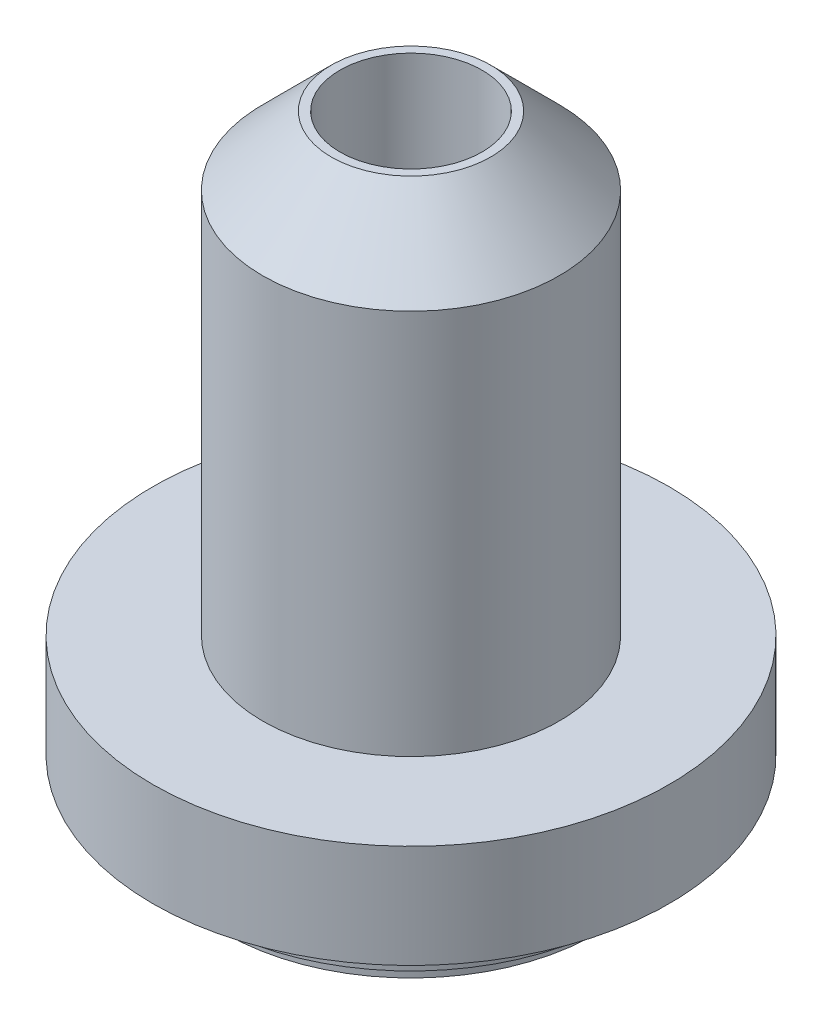
ISO-10303-21;
HEADER;
FILE_DESCRIPTION(('STEP AP214'),'2;1');
FILE_NAME('part.step','',(''),(''),'','','');
FILE_SCHEMA(('AUTOMOTIVE_DESIGN { 1 0 10303 214 1 1 1 1 }'));
ENDSEC;
DATA;
#1=APPLICATION_CONTEXT('core data for automotive mechanical design processes');
#2=APPLICATION_PROTOCOL_DEFINITION('international standard','automotive_design',2000,#1);
#3=PRODUCT_CONTEXT('',#1,'mechanical');
#4=PRODUCT('Part','Part','',(#3));
#5=PRODUCT_RELATED_PRODUCT_CATEGORY('part','',(#4));
#6=PRODUCT_DEFINITION_FORMATION('','',#4);
#7=PRODUCT_DEFINITION_CONTEXT('part definition',#1,'design');
#8=PRODUCT_DEFINITION('design','',#6,#7);
#9=PRODUCT_DEFINITION_SHAPE('','',#8);
#10=(LENGTH_UNIT() NAMED_UNIT(*) SI_UNIT(.MILLI.,.METRE.));
#11=(NAMED_UNIT(*) PLANE_ANGLE_UNIT() SI_UNIT($,.RADIAN.));
#12=(NAMED_UNIT(*) SI_UNIT($,.STERADIAN.) SOLID_ANGLE_UNIT());
#13=UNCERTAINTY_MEASURE_WITH_UNIT(LENGTH_MEASURE(1.E-05),#10,'distance_accuracy_value','');
#14=(GEOMETRIC_REPRESENTATION_CONTEXT(3) GLOBAL_UNCERTAINTY_ASSIGNED_CONTEXT((#13)) GLOBAL_UNIT_ASSIGNED_CONTEXT((#10,
#11,#12)) REPRESENTATION_CONTEXT('',''));
#15=CARTESIAN_POINT('',(0.,0.,0.));
#16=DIRECTION('',(0.,0.,1.));
#17=DIRECTION('',(1.,0.,0.));
#18=AXIS2_PLACEMENT_3D('',#15,#16,#17);
#19=CARTESIAN_POINT('',(0.,17.145,0.));
#20=DIRECTION('',(0.,-1.,0.));
#21=DIRECTION('',(0.,0.,-1.));
#22=AXIS2_PLACEMENT_3D('',#19,#20,#21);
#23=CYLINDRICAL_SURFACE('',#22,4.5593);
#24=CARTESIAN_POINT('',(0.,3.175,0.));
#25=DIRECTION('',(0.,1.,0.));
#26=DIRECTION('',(0.,0.,1.));
#27=AXIS2_PLACEMENT_3D('',#24,#25,#26);
#28=CIRCLE('',#27,4.5593);
#29=CARTESIAN_POINT('',(0.,3.175,4.5593));
#30=VERTEX_POINT('',#29);
#31=EDGE_CURVE('E10',#30,#30,#28,.T.);
#32=ORIENTED_EDGE('',*,*,#31,.T.);
#33=EDGE_LOOP('',(#32));
#34=FACE_BOUND('',#33,.T.);
#35=CARTESIAN_POINT('',(0.,15.0368,0.));
#36=DIRECTION('',(0.,-1.,0.));
#37=DIRECTION('',(0.,0.,-1.));
#38=AXIS2_PLACEMENT_3D('',#35,#36,#37);
#39=CIRCLE('',#38,4.5593);
#40=CARTESIAN_POINT('',(0.,15.0368,-4.5593));
#41=VERTEX_POINT('',#40);
#42=EDGE_CURVE('E56',#41,#41,#39,.F.);
#43=ORIENTED_EDGE('',*,*,#42,.F.);
#44=EDGE_LOOP('',(#43));
#45=FACE_BOUND('',#44,.T.);
#46=ADVANCED_FACE('F37',(#34,#45),#23,.T.);
#47=CARTESIAN_POINT('',(0.,3.175,0.));
#48=DIRECTION('',(0.,-1.,0.));
#49=DIRECTION('',(0.,0.,-1.));
#50=AXIS2_PLACEMENT_3D('',#47,#48,#49);
#51=CYLINDRICAL_SURFACE('',#50,7.9375);
#52=CARTESIAN_POINT('',(0.,3.175,0.));
#53=DIRECTION('',(0.,1.,0.));
#54=DIRECTION('',(0.,0.,1.));
#55=AXIS2_PLACEMENT_3D('',#52,#53,#54);
#56=CIRCLE('',#55,7.9375);
#57=CARTESIAN_POINT('',(0.,3.175,7.9375));
#58=VERTEX_POINT('',#57);
#59=EDGE_CURVE('E68',#58,#58,#56,.T.);
#60=ORIENTED_EDGE('',*,*,#59,.F.);
#61=EDGE_LOOP('',(#60));
#62=FACE_BOUND('',#61,.T.);
#63=CARTESIAN_POINT('',(0.,0.,0.));
#64=DIRECTION('',(0.,1.,0.));
#65=DIRECTION('',(0.,0.,1.));
#66=AXIS2_PLACEMENT_3D('',#63,#64,#65);
#67=CIRCLE('',#66,7.9375);
#68=CARTESIAN_POINT('',(0.,0.,7.9375));
#69=VERTEX_POINT('',#68);
#70=EDGE_CURVE('E41',#69,#69,#67,.T.);
#71=ORIENTED_EDGE('',*,*,#70,.T.);
#72=EDGE_LOOP('',(#71));
#73=FACE_BOUND('',#72,.T.);
#74=ADVANCED_FACE('F39',(#62,#73),#51,.T.);
#75=CARTESIAN_POINT('',(0.,3.175,0.));
#76=DIRECTION('',(0.,1.,0.));
#77=DIRECTION('',(0.,0.,1.));
#78=AXIS2_PLACEMENT_3D('',#75,#76,#77);
#79=PLANE('',#78);
#80=ORIENTED_EDGE('',*,*,#31,.F.);
#81=EDGE_LOOP('',(#80));
#82=FACE_BOUND('',#81,.T.);
#83=ORIENTED_EDGE('',*,*,#59,.T.);
#84=EDGE_LOOP('',(#83));
#85=FACE_BOUND('',#84,.T.);
#86=ADVANCED_FACE('F81',(#82,#85),#79,.T.);
#87=CARTESIAN_POINT('',(0.,0.,0.));
#88=DIRECTION('',(0.,1.,0.));
#89=DIRECTION('',(0.,0.,1.));
#90=AXIS2_PLACEMENT_3D('',#87,#88,#89);
#91=PLANE('',#90);
#92=CARTESIAN_POINT('',(0.,0.,0.));
#93=DIRECTION('',(0.,-1.,0.));
#94=DIRECTION('',(0.,0.,-1.));
#95=AXIS2_PLACEMENT_3D('',#92,#93,#94);
#96=CIRCLE('',#95,6.35);
#97=CARTESIAN_POINT('',(0.,0.,-6.35));
#98=VERTEX_POINT('',#97);
#99=EDGE_CURVE('E52',#98,#98,#96,.T.);
#100=ORIENTED_EDGE('',*,*,#99,.F.);
#101=EDGE_LOOP('',(#100));
#102=FACE_BOUND('',#101,.T.);
#103=ORIENTED_EDGE('',*,*,#70,.F.);
#104=EDGE_LOOP('',(#103));
#105=FACE_BOUND('',#104,.T.);
#106=ADVANCED_FACE('F78',(#102,#105),#91,.F.);
#107=CARTESIAN_POINT('',(0.,-1.27,0.));
#108=DIRECTION('',(0.,1.,0.));
#109=DIRECTION('',(0.,0.,1.));
#110=AXIS2_PLACEMENT_3D('',#107,#108,#109);
#111=CYLINDRICAL_SURFACE('',#110,6.35);
#112=CARTESIAN_POINT('',(0.,-1.27,0.));
#113=DIRECTION('',(0.,-1.,0.));
#114=DIRECTION('',(0.,0.,-1.));
#115=AXIS2_PLACEMENT_3D('',#112,#113,#114);
#116=CIRCLE('',#115,6.35);
#117=CARTESIAN_POINT('',(0.,-1.27,-6.35));
#118=VERTEX_POINT('',#117);
#119=EDGE_CURVE('E61',#118,#118,#116,.T.);
#120=ORIENTED_EDGE('',*,*,#119,.F.);
#121=EDGE_LOOP('',(#120));
#122=FACE_BOUND('',#121,.T.);
#123=ORIENTED_EDGE('',*,*,#99,.T.);
#124=EDGE_LOOP('',(#123));
#125=FACE_BOUND('',#124,.T.);
#126=ADVANCED_FACE('F80',(#122,#125),#111,.T.);
#127=CARTESIAN_POINT('',(0.,-1.27,0.));
#128=DIRECTION('',(0.,-1.,0.));
#129=DIRECTION('',(0.,0.,-1.));
#130=AXIS2_PLACEMENT_3D('',#127,#128,#129);
#131=PLANE('',#130);
#132=CARTESIAN_POINT('',(0.,-1.27,0.));
#133=DIRECTION('',(0.,-1.,0.));
#134=DIRECTION('',(0.,0.,-1.));
#135=AXIS2_PLACEMENT_3D('',#132,#133,#134);
#136=CIRCLE('',#135,5.715);
#137=CARTESIAN_POINT('',(0.,-1.27,-5.715));
#138=VERTEX_POINT('',#137);
#139=EDGE_CURVE('E46',#138,#138,#136,.T.);
#140=ORIENTED_EDGE('',*,*,#139,.F.);
#141=EDGE_LOOP('',(#140));
#142=FACE_BOUND('',#141,.T.);
#143=ORIENTED_EDGE('',*,*,#119,.T.);
#144=EDGE_LOOP('',(#143));
#145=FACE_BOUND('',#144,.T.);
#146=ADVANCED_FACE('F87',(#142,#145),#131,.T.);
#147=CARTESIAN_POINT('',(0.,-1.905,0.));
#148=DIRECTION('',(0.,1.,0.));
#149=DIRECTION('',(0.,0.,1.));
#150=AXIS2_PLACEMENT_3D('',#147,#148,#149);
#151=CYLINDRICAL_SURFACE('',#150,5.715);
#152=CARTESIAN_POINT('',(0.,-1.905,0.));
#153=DIRECTION('',(0.,-1.,0.));
#154=DIRECTION('',(0.,0.,-1.));
#155=AXIS2_PLACEMENT_3D('',#152,#153,#154);
#156=CIRCLE('',#155,5.715);
#157=CARTESIAN_POINT('',(0.,-1.905,-5.715));
#158=VERTEX_POINT('',#157);
#159=EDGE_CURVE('E58',#158,#158,#156,.T.);
#160=ORIENTED_EDGE('',*,*,#159,.F.);
#161=EDGE_LOOP('',(#160));
#162=FACE_BOUND('',#161,.T.);
#163=ORIENTED_EDGE('',*,*,#139,.T.);
#164=EDGE_LOOP('',(#163));
#165=FACE_BOUND('',#164,.T.);
#166=ADVANCED_FACE('F108',(#162,#165),#151,.T.);
#167=CARTESIAN_POINT('',(0.,-1.905,0.));
#168=DIRECTION('',(0.,-1.,0.));
#169=DIRECTION('',(0.,0.,-1.));
#170=AXIS2_PLACEMENT_3D('',#167,#168,#169);
#171=PLANE('',#170);
#172=CARTESIAN_POINT('',(0.,-1.905,0.));
#173=DIRECTION('',(0.,1.,0.));
#174=DIRECTION('',(0.,0.,1.));
#175=AXIS2_PLACEMENT_3D('',#172,#173,#174);
#176=CIRCLE('',#175,2.1844);
#177=CARTESIAN_POINT('',(0.,-1.905,2.1844));
#178=VERTEX_POINT('',#177);
#179=EDGE_CURVE('E193',#178,#178,#176,.T.);
#180=ORIENTED_EDGE('',*,*,#179,.T.);
#181=EDGE_LOOP('',(#180));
#182=FACE_BOUND('',#181,.T.);
#183=ORIENTED_EDGE('',*,*,#159,.T.);
#184=EDGE_LOOP('',(#183));
#185=FACE_BOUND('',#184,.T.);
#186=ADVANCED_FACE('F104',(#182,#185),#171,.T.);
#187=CARTESIAN_POINT('',(0.,17.145,0.));
#188=DIRECTION('',(0.,-1.,0.));
#189=DIRECTION('',(0.,0.,1.));
#190=AXIS2_PLACEMENT_3D('',#187,#188,#189);
#191=CONICAL_SURFACE('',#190,2.4511,0.78539816339745);
#192=CARTESIAN_POINT('',(0.,17.145,0.));
#193=DIRECTION('',(0.,1.,0.));
#194=DIRECTION('',(0.,0.,1.));
#195=AXIS2_PLACEMENT_3D('',#192,#193,#194);
#196=CIRCLE('',#195,2.4511);
#197=CARTESIAN_POINT('',(0.,17.145,2.4511));
#198=VERTEX_POINT('',#197);
#199=EDGE_CURVE('E200',#198,#198,#196,.T.);
#200=ORIENTED_EDGE('',*,*,#199,.F.);
#201=EDGE_LOOP('',(#200));
#202=FACE_BOUND('',#201,.T.);
#203=ORIENTED_EDGE('',*,*,#42,.T.);
#204=EDGE_LOOP('',(#203));
#205=FACE_BOUND('',#204,.T.);
#206=ADVANCED_FACE('F107',(#202,#205),#191,.T.);
#207=CARTESIAN_POINT('',(0.,17.145,0.));
#208=DIRECTION('',(0.,1.,0.));
#209=DIRECTION('',(0.,0.,1.));
#210=AXIS2_PLACEMENT_3D('',#207,#208,#209);
#211=PLANE('',#210);
#212=CARTESIAN_POINT('',(0.,17.145,0.));
#213=DIRECTION('',(0.,1.,0.));
#214=DIRECTION('',(0.,0.,1.));
#215=AXIS2_PLACEMENT_3D('',#212,#213,#214);
#216=CIRCLE('',#215,2.1844);
#217=CARTESIAN_POINT('',(0.,17.145,2.1844));
#218=VERTEX_POINT('',#217);
#219=EDGE_CURVE('E196',#218,#218,#216,.T.);
#220=ORIENTED_EDGE('',*,*,#219,.F.);
#221=EDGE_LOOP('',(#220));
#222=FACE_BOUND('',#221,.T.);
#223=ORIENTED_EDGE('',*,*,#199,.T.);
#224=EDGE_LOOP('',(#223));
#225=FACE_BOUND('',#224,.T.);
#226=ADVANCED_FACE('F102',(#222,#225),#211,.T.);
#227=CARTESIAN_POINT('',(0.,-1.905,0.));
#228=DIRECTION('',(0.,1.,0.));
#229=DIRECTION('',(0.,0.,1.));
#230=AXIS2_PLACEMENT_3D('',#227,#228,#229);
#231=CYLINDRICAL_SURFACE('',#230,2.1844);
#232=CARTESIAN_POINT('',(0.,-1.905,2.1844));
#233=CARTESIAN_POINT('',(0.,-1.7065625,2.1844));
#234=CARTESIAN_POINT('',(0.,-1.508125,2.1844));
#235=CARTESIAN_POINT('',(0.,-1.11125,2.1844));
#236=CARTESIAN_POINT('',(0.,-0.9128125,2.1844));
#237=CARTESIAN_POINT('',(0.,-0.5159375,2.1844));
#238=CARTESIAN_POINT('',(0.,-0.3175,2.1844));
#239=CARTESIAN_POINT('',(0.,0.0793749999999997,2.1844));
#240=CARTESIAN_POINT('',(0.,0.2778125,2.1844));
#241=CARTESIAN_POINT('',(0.,0.6746875,2.1844));
#242=CARTESIAN_POINT('',(0.,0.873125,2.1844));
#243=CARTESIAN_POINT('',(0.,1.27,2.1844));
#244=CARTESIAN_POINT('',(0.,1.4684375,2.1844));
#245=CARTESIAN_POINT('',(0.,1.8653125,2.1844));
#246=CARTESIAN_POINT('',(0.,2.06375,2.1844));
#247=CARTESIAN_POINT('',(0.,2.460625,2.1844));
#248=CARTESIAN_POINT('',(0.,2.6590625,2.1844));
#249=CARTESIAN_POINT('',(0.,3.0559375,2.1844));
#250=CARTESIAN_POINT('',(0.,3.254375,2.1844));
#251=CARTESIAN_POINT('',(0.,3.65125,2.1844));
#252=CARTESIAN_POINT('',(0.,3.8496875,2.1844));
#253=CARTESIAN_POINT('',(0.,4.2465625,2.1844));
#254=CARTESIAN_POINT('',(0.,4.445,2.1844));
#255=CARTESIAN_POINT('',(0.,4.841875,2.1844));
#256=CARTESIAN_POINT('',(0.,5.0403125,2.1844));
#257=CARTESIAN_POINT('',(0.,5.4371875,2.1844));
#258=CARTESIAN_POINT('',(0.,5.635625,2.1844));
#259=CARTESIAN_POINT('',(0.,6.0325,2.1844));
#260=CARTESIAN_POINT('',(0.,6.2309375,2.1844));
#261=CARTESIAN_POINT('',(0.,6.6278125,2.1844));
#262=CARTESIAN_POINT('',(0.,6.82625,2.1844));
#263=CARTESIAN_POINT('',(0.,7.223125,2.1844));
#264=CARTESIAN_POINT('',(0.,7.4215625,2.1844));
#265=CARTESIAN_POINT('',(0.,7.8184375,2.1844));
#266=CARTESIAN_POINT('',(0.,8.016875,2.1844));
#267=CARTESIAN_POINT('',(0.,8.41375,2.1844));
#268=CARTESIAN_POINT('',(0.,8.6121875,2.1844));
#269=CARTESIAN_POINT('',(0.,9.0090625,2.1844));
#270=CARTESIAN_POINT('',(0.,9.2075,2.1844));
#271=CARTESIAN_POINT('',(0.,9.604375,2.1844));
#272=CARTESIAN_POINT('',(0.,9.8028125,2.1844));
#273=CARTESIAN_POINT('',(0.,10.1996875,2.1844));
#274=CARTESIAN_POINT('',(0.,10.398125,2.1844));
#275=CARTESIAN_POINT('',(0.,10.795,2.1844));
#276=CARTESIAN_POINT('',(0.,10.9934375,2.1844));
#277=CARTESIAN_POINT('',(0.,11.3903125,2.1844));
#278=CARTESIAN_POINT('',(0.,11.58875,2.1844));
#279=CARTESIAN_POINT('',(0.,11.985625,2.1844));
#280=CARTESIAN_POINT('',(0.,12.1840625,2.1844));
#281=CARTESIAN_POINT('',(0.,12.5809375,2.1844));
#282=CARTESIAN_POINT('',(0.,12.779375,2.1844));
#283=CARTESIAN_POINT('',(0.,13.17625,2.1844));
#284=CARTESIAN_POINT('',(0.,13.3746875,2.1844));
#285=CARTESIAN_POINT('',(0.,13.7715625,2.1844));
#286=CARTESIAN_POINT('',(0.,13.97,2.1844));
#287=CARTESIAN_POINT('',(0.,14.366875,2.1844));
#288=CARTESIAN_POINT('',(0.,14.5653125,2.1844));
#289=CARTESIAN_POINT('',(0.,14.9621875,2.1844));
#290=CARTESIAN_POINT('',(0.,15.160625,2.1844));
#291=CARTESIAN_POINT('',(0.,15.5575,2.1844));
#292=CARTESIAN_POINT('',(0.,15.7559375,2.1844));
#293=CARTESIAN_POINT('',(0.,16.1528125,2.1844));
#294=CARTESIAN_POINT('',(0.,16.35125,2.1844));
#295=CARTESIAN_POINT('',(0.,16.748125,2.1844));
#296=CARTESIAN_POINT('',(0.,16.9465625,2.1844));
#297=CARTESIAN_POINT('',(0.,17.145,2.1844));
#298=B_SPLINE_CURVE_WITH_KNOTS('',3,(#232,#233,#234,#235,#236,#237,#238,#239,#240,#241,#242,
#243,#244,#245,#246,#247,#248,#249,#250,#251,#252,#253,#254,#255,#256,#257,#258,#259,#260,#261,
#262,#263,#264,#265,#266,#267,#268,#269,#270,#271,#272,#273,#274,#275,#276,#277,#278,#279,#280,
#281,#282,#283,#284,#285,#286,#287,#288,#289,#290,#291,#292,#293,#294,#295,#296,#297),
.UNSPECIFIED.,.F.,.F.,(4,2,2,2,2,2,2,2,2,2,2,2,2,2,2,2,2,2,2,2,2,2,2,2,2,2,2,2,2,2,2,2,4),(0.,
0.5953125,1.190625,1.7859375,2.38125,2.9765625,3.571875,4.1671875,4.7625,5.3578125,5.953125,
6.5484375,7.14375,7.7390625,8.334375,8.9296875,9.525,10.1203125,10.715625,11.3109375,11.90625,
12.5015625,13.096875,13.6921875,14.2875,14.8828125,15.478125,16.0734375,16.66875,17.2640625,
17.859375,18.4546875,19.05),.UNSPECIFIED.);
#299=EDGE_CURVE('BSEAM145',#178,#218,#298,.T.);
#300=ORIENTED_EDGE('',*,*,#179,.F.);
#301=ORIENTED_EDGE('',*,*,#219,.T.);
#302=ORIENTED_EDGE('',*,*,#299,.T.);
#303=ORIENTED_EDGE('',*,*,#299,.F.);
#304=EDGE_LOOP('',(#300,#302,#301,#303));
#305=FACE_BOUND('',#304,.T.);
#306=ADVANCED_FACE('F145',(#305),#231,.F.);
#307=CLOSED_SHELL('',(#46,#74,#86,#106,#126,#146,#166,#186,#206,#226,#306));
#308=MANIFOLD_SOLID_BREP('B2',#307);
#309=ADVANCED_BREP_SHAPE_REPRESENTATION('',(#18,#308),#14);
#310=SHAPE_DEFINITION_REPRESENTATION(#9,#309);
ENDSEC;
END-ISO-10303-21;
